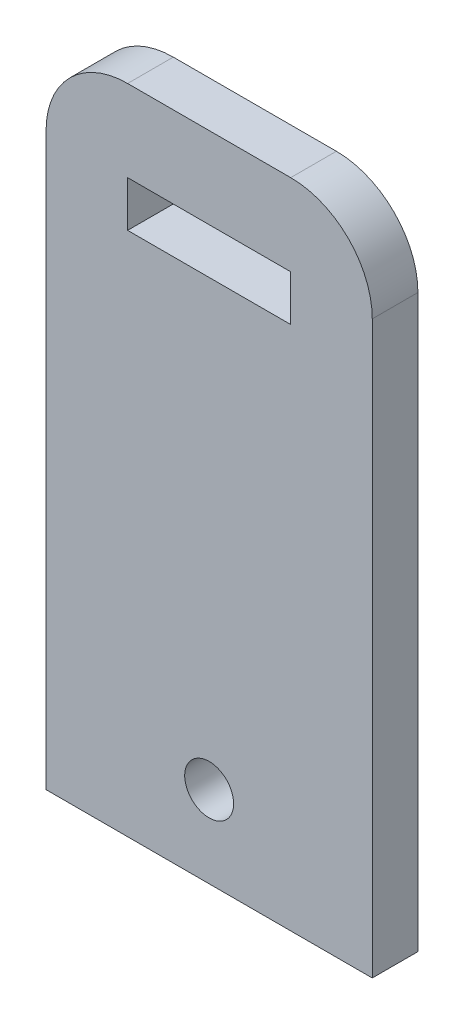
ISO-10303-21;
HEADER;
FILE_DESCRIPTION(('STEP AP214'),'2;1');
FILE_NAME('part.step','',(''),(''),'','','');
FILE_SCHEMA(('AUTOMOTIVE_DESIGN { 1 0 10303 214 1 1 1 1 }'));
ENDSEC;
DATA;
#1=APPLICATION_CONTEXT('core data for automotive mechanical design processes');
#2=APPLICATION_PROTOCOL_DEFINITION('international standard','automotive_design',2000,#1);
#3=PRODUCT_CONTEXT('',#1,'mechanical');
#4=PRODUCT('Part','Part','',(#3));
#5=PRODUCT_RELATED_PRODUCT_CATEGORY('part','',(#4));
#6=PRODUCT_DEFINITION_FORMATION('','',#4);
#7=PRODUCT_DEFINITION_CONTEXT('part definition',#1,'design');
#8=PRODUCT_DEFINITION('design','',#6,#7);
#9=PRODUCT_DEFINITION_SHAPE('','',#8);
#10=(LENGTH_UNIT() NAMED_UNIT(*) SI_UNIT(.MILLI.,.METRE.));
#11=(NAMED_UNIT(*) PLANE_ANGLE_UNIT() SI_UNIT($,.RADIAN.));
#12=(NAMED_UNIT(*) SI_UNIT($,.STERADIAN.) SOLID_ANGLE_UNIT());
#13=UNCERTAINTY_MEASURE_WITH_UNIT(LENGTH_MEASURE(1.E-05),#10,'distance_accuracy_value','');
#14=(GEOMETRIC_REPRESENTATION_CONTEXT(3) GLOBAL_UNCERTAINTY_ASSIGNED_CONTEXT((#13)) GLOBAL_UNIT_ASSIGNED_CONTEXT((#10,
#11,#12)) REPRESENTATION_CONTEXT('',''));
#15=CARTESIAN_POINT('',(0.,0.,0.));
#16=DIRECTION('',(0.,0.,1.));
#17=DIRECTION('',(1.,0.,0.));
#18=AXIS2_PLACEMENT_3D('',#15,#16,#17);
#19=CARTESIAN_POINT('',(219.111848309619,30.8656180362544,2.8));
#20=DIRECTION('',(0.,0.,1.));
#21=DIRECTION('',(1.,0.,0.));
#22=AXIS2_PLACEMENT_3D('',#19,#20,#21);
#23=PLANE('',#22);
#24=DIRECTION('',(1.,0.,0.));
#25=VECTOR('',#24,1.);
#26=CARTESIAN_POINT('',(219.111848309619,28.0656180362544,2.8));
#27=LINE('',#26,#25);
#28=CARTESIAN_POINT('',(219.111848309619,28.0656180362544,2.8));
#29=VERTEX_POINT('',#28);
#30=CARTESIAN_POINT('',(229.111848309619,28.0656180362544,2.8));
#31=VERTEX_POINT('',#30);
#32=EDGE_CURVE('E121',#29,#31,#27,.T.);
#33=ORIENTED_EDGE('',*,*,#32,.F.);
#34=DIRECTION('',(0.,-1.,0.));
#35=VECTOR('',#34,1.);
#36=CARTESIAN_POINT('',(219.111848309619,30.8656180362544,2.8));
#37=LINE('',#36,#35);
#38=CARTESIAN_POINT('',(219.111848309619,30.8656180362544,2.8));
#39=VERTEX_POINT('',#38);
#40=EDGE_CURVE('E113',#39,#29,#37,.T.);
#41=ORIENTED_EDGE('',*,*,#40,.F.);
#42=DIRECTION('',(-1.,0.,0.));
#43=VECTOR('',#42,1.);
#44=CARTESIAN_POINT('',(229.111848309619,30.8656180362544,2.8));
#45=LINE('',#44,#43);
#46=CARTESIAN_POINT('',(229.111848309619,30.8656180362544,2.8));
#47=VERTEX_POINT('',#46);
#48=EDGE_CURVE('E136',#47,#39,#45,.T.);
#49=ORIENTED_EDGE('',*,*,#48,.F.);
#50=DIRECTION('',(0.,1.,0.));
#51=VECTOR('',#50,1.);
#52=CARTESIAN_POINT('',(229.111848309619,28.0656180362544,2.8));
#53=LINE('',#52,#51);
#54=EDGE_CURVE('E134',#31,#47,#53,.T.);
#55=ORIENTED_EDGE('',*,*,#54,.F.);
#56=EDGE_LOOP('',(#33,#41,#49,#55));
#57=FACE_BOUND('',#56,.T.);
#58=CARTESIAN_POINT('',(219.111848309619,30.8656180362544,2.8));
#59=DIRECTION('',(0.,0.,1.));
#60=DIRECTION('',(1.,0.,0.));
#61=AXIS2_PLACEMENT_3D('',#58,#59,#60);
#62=CIRCLE('',#61,4.99999999999999);
#63=CARTESIAN_POINT('',(219.111848309619,35.8656180362543,2.8));
#64=VERTEX_POINT('',#63);
#65=CARTESIAN_POINT('',(214.111848309619,30.8656180362544,2.8));
#66=VERTEX_POINT('',#65);
#67=EDGE_CURVE('E152',#64,#66,#62,.T.);
#68=ORIENTED_EDGE('',*,*,#67,.T.);
#69=DIRECTION('',(0.,-1.,0.));
#70=VECTOR('',#69,1.);
#71=CARTESIAN_POINT('',(214.111848309619,30.8656180362544,2.8));
#72=LINE('',#71,#70);
#73=CARTESIAN_POINT('',(214.111848309619,-4.13438196374565,2.8));
#74=VERTEX_POINT('',#73);
#75=EDGE_CURVE('E155',#66,#74,#72,.T.);
#76=ORIENTED_EDGE('',*,*,#75,.T.);
#77=DIRECTION('',(1.,0.,0.));
#78=VECTOR('',#77,1.);
#79=CARTESIAN_POINT('',(214.111848309619,-4.13438196374565,2.8));
#80=LINE('',#79,#78);
#81=CARTESIAN_POINT('',(234.111848309619,-4.13438196374565,2.8));
#82=VERTEX_POINT('',#81);
#83=EDGE_CURVE('E158',#74,#82,#80,.T.);
#84=ORIENTED_EDGE('',*,*,#83,.T.);
#85=DIRECTION('',(0.,1.,0.));
#86=VECTOR('',#85,1.);
#87=CARTESIAN_POINT('',(234.111848309619,-4.13438196374565,2.8));
#88=LINE('',#87,#86);
#89=CARTESIAN_POINT('',(234.111848309619,30.8656180362544,2.8));
#90=VERTEX_POINT('',#89);
#91=EDGE_CURVE('E160',#82,#90,#88,.T.);
#92=ORIENTED_EDGE('',*,*,#91,.T.);
#93=CARTESIAN_POINT('',(229.111848309619,30.8656180362544,2.8));
#94=DIRECTION('',(0.,0.,1.));
#95=DIRECTION('',(1.,0.,0.));
#96=AXIS2_PLACEMENT_3D('',#93,#94,#95);
#97=CIRCLE('',#96,4.99999999999999);
#98=CARTESIAN_POINT('',(229.111848309619,35.8656180362543,2.8));
#99=VERTEX_POINT('',#98);
#100=EDGE_CURVE('E162',#90,#99,#97,.T.);
#101=ORIENTED_EDGE('',*,*,#100,.T.);
#102=DIRECTION('',(-1.,0.,0.));
#103=VECTOR('',#102,1.);
#104=CARTESIAN_POINT('',(229.111848309619,35.8656180362543,2.8));
#105=LINE('',#104,#103);
#106=EDGE_CURVE('E164',#99,#64,#105,.T.);
#107=ORIENTED_EDGE('',*,*,#106,.T.);
#108=EDGE_LOOP('',(#68,#76,#84,#92,#101,#107));
#109=FACE_BOUND('',#108,.T.);
#110=CARTESIAN_POINT('',(224.111848309619,0.865618036254359,2.8));
#111=DIRECTION('',(0.,0.,1.));
#112=DIRECTION('',(1.,0.,0.));
#113=AXIS2_PLACEMENT_3D('',#110,#111,#112);
#114=CIRCLE('',#113,1.5);
#115=CARTESIAN_POINT('',(225.611848309619,0.865618036254359,2.8));
#116=VERTEX_POINT('',#115);
#117=EDGE_CURVE('E142',#116,#116,#114,.T.);
#118=ORIENTED_EDGE('',*,*,#117,.F.);
#119=EDGE_LOOP('',(#118));
#120=FACE_BOUND('',#119,.T.);
#121=ADVANCED_FACE('F36',(#57,#109,#120),#23,.T.);
#122=CARTESIAN_POINT('',(219.111848309619,30.8656180362544,0.));
#123=DIRECTION('',(0.,0.,1.));
#124=DIRECTION('',(1.,0.,0.));
#125=AXIS2_PLACEMENT_3D('',#122,#123,#124);
#126=PLANE('',#125);
#127=CARTESIAN_POINT('',(219.111848309619,30.8656180362544,0.));
#128=DIRECTION('',(0.,0.,1.));
#129=DIRECTION('',(1.,0.,0.));
#130=AXIS2_PLACEMENT_3D('',#127,#128,#129);
#131=CIRCLE('',#130,4.99999999999999);
#132=CARTESIAN_POINT('',(219.111848309619,35.8656180362543,0.));
#133=VERTEX_POINT('',#132);
#134=CARTESIAN_POINT('',(214.111848309619,30.8656180362544,0.));
#135=VERTEX_POINT('',#134);
#136=EDGE_CURVE('E129',#133,#135,#131,.T.);
#137=ORIENTED_EDGE('',*,*,#136,.F.);
#138=DIRECTION('',(-1.,0.,0.));
#139=VECTOR('',#138,1.);
#140=CARTESIAN_POINT('',(229.111848309619,35.8656180362543,0.));
#141=LINE('',#140,#139);
#142=CARTESIAN_POINT('',(229.111848309619,35.8656180362543,0.));
#143=VERTEX_POINT('',#142);
#144=EDGE_CURVE('E156',#143,#133,#141,.T.);
#145=ORIENTED_EDGE('',*,*,#144,.F.);
#146=CARTESIAN_POINT('',(229.111848309619,30.8656180362544,0.));
#147=DIRECTION('',(0.,0.,1.));
#148=DIRECTION('',(1.,0.,0.));
#149=AXIS2_PLACEMENT_3D('',#146,#147,#148);
#150=CIRCLE('',#149,4.99999999999999);
#151=CARTESIAN_POINT('',(234.111848309619,30.8656180362544,0.));
#152=VERTEX_POINT('',#151);
#153=EDGE_CURVE('E175',#152,#143,#150,.T.);
#154=ORIENTED_EDGE('',*,*,#153,.F.);
#155=DIRECTION('',(0.,1.,0.));
#156=VECTOR('',#155,1.);
#157=CARTESIAN_POINT('',(234.111848309619,-4.13438196374565,0.));
#158=LINE('',#157,#156);
#159=CARTESIAN_POINT('',(234.111848309619,-4.13438196374565,0.));
#160=VERTEX_POINT('',#159);
#161=EDGE_CURVE('E173',#160,#152,#158,.T.);
#162=ORIENTED_EDGE('',*,*,#161,.F.);
#163=DIRECTION('',(1.,0.,0.));
#164=VECTOR('',#163,1.);
#165=CARTESIAN_POINT('',(214.111848309619,-4.13438196374565,0.));
#166=LINE('',#165,#164);
#167=CARTESIAN_POINT('',(214.111848309619,-4.13438196374565,0.));
#168=VERTEX_POINT('',#167);
#169=EDGE_CURVE('E171',#168,#160,#166,.T.);
#170=ORIENTED_EDGE('',*,*,#169,.F.);
#171=DIRECTION('',(0.,-1.,0.));
#172=VECTOR('',#171,1.);
#173=CARTESIAN_POINT('',(214.111848309619,30.8656180362544,0.));
#174=LINE('',#173,#172);
#175=EDGE_CURVE('E169',#135,#168,#174,.T.);
#176=ORIENTED_EDGE('',*,*,#175,.F.);
#177=EDGE_LOOP('',(#137,#145,#154,#162,#170,#176));
#178=FACE_BOUND('',#177,.T.);
#179=DIRECTION('',(0.,-1.,0.));
#180=VECTOR('',#179,1.);
#181=CARTESIAN_POINT('',(219.111848309619,30.8656180362544,0.));
#182=LINE('',#181,#180);
#183=CARTESIAN_POINT('',(219.111848309619,30.8656180362544,0.));
#184=VERTEX_POINT('',#183);
#185=CARTESIAN_POINT('',(219.111848309619,28.0656180362544,0.));
#186=VERTEX_POINT('',#185);
#187=EDGE_CURVE('E59',#184,#186,#182,.T.);
#188=ORIENTED_EDGE('',*,*,#187,.T.);
#189=DIRECTION('',(1.,0.,0.));
#190=VECTOR('',#189,1.);
#191=CARTESIAN_POINT('',(219.111848309619,28.0656180362544,0.));
#192=LINE('',#191,#190);
#193=CARTESIAN_POINT('',(229.111848309619,28.0656180362544,0.));
#194=VERTEX_POINT('',#193);
#195=EDGE_CURVE('E128',#186,#194,#192,.T.);
#196=ORIENTED_EDGE('',*,*,#195,.T.);
#197=DIRECTION('',(0.,1.,0.));
#198=VECTOR('',#197,1.);
#199=CARTESIAN_POINT('',(229.111848309619,28.0656180362544,0.));
#200=LINE('',#199,#198);
#201=CARTESIAN_POINT('',(229.111848309619,30.8656180362544,0.));
#202=VERTEX_POINT('',#201);
#203=EDGE_CURVE('E144',#194,#202,#200,.T.);
#204=ORIENTED_EDGE('',*,*,#203,.T.);
#205=DIRECTION('',(-1.,0.,0.));
#206=VECTOR('',#205,1.);
#207=CARTESIAN_POINT('',(224.111848309619,30.8656180362544,0.));
#208=LINE('',#207,#206);
#209=EDGE_CURVE('E122',#202,#184,#208,.T.);
#210=ORIENTED_EDGE('',*,*,#209,.T.);
#211=EDGE_LOOP('',(#188,#196,#204,#210));
#212=FACE_BOUND('',#211,.T.);
#213=CARTESIAN_POINT('',(224.111848309619,0.865618036254359,0.));
#214=DIRECTION('',(0.,0.,1.));
#215=DIRECTION('',(1.,0.,0.));
#216=AXIS2_PLACEMENT_3D('',#213,#214,#215);
#217=CIRCLE('',#216,1.5);
#218=CARTESIAN_POINT('',(225.611848309619,0.865618036254359,0.));
#219=VERTEX_POINT('',#218);
#220=EDGE_CURVE('E254',#219,#219,#217,.T.);
#221=ORIENTED_EDGE('',*,*,#220,.T.);
#222=EDGE_LOOP('',(#221));
#223=FACE_BOUND('',#222,.T.);
#224=ADVANCED_FACE('F199',(#178,#212,#223),#126,.F.);
#225=CARTESIAN_POINT('',(219.111848309619,30.8656180362544,2.8));
#226=DIRECTION('',(0.,0.,-1.));
#227=DIRECTION('',(-1.,0.,0.));
#228=AXIS2_PLACEMENT_3D('',#225,#226,#227);
#229=CYLINDRICAL_SURFACE('',#228,4.99999999999999);
#230=ORIENTED_EDGE('',*,*,#136,.T.);
#231=DIRECTION('',(0.,0.,-1.));
#232=VECTOR('',#231,1.);
#233=CARTESIAN_POINT('',(214.111848309619,30.8656180362544,2.8));
#234=LINE('',#233,#232);
#235=EDGE_CURVE('E11',#66,#135,#234,.T.);
#236=ORIENTED_EDGE('',*,*,#235,.F.);
#237=ORIENTED_EDGE('',*,*,#67,.F.);
#238=DIRECTION('',(0.,0.,-1.));
#239=VECTOR('',#238,1.);
#240=CARTESIAN_POINT('',(219.111848309619,35.8656180362543,2.8));
#241=LINE('',#240,#239);
#242=EDGE_CURVE('E166',#64,#133,#241,.T.);
#243=ORIENTED_EDGE('',*,*,#242,.T.);
#244=EDGE_LOOP('',(#230,#236,#237,#243));
#245=FACE_BOUND('',#244,.T.);
#246=ADVANCED_FACE('F38',(#245),#229,.T.);
#247=CARTESIAN_POINT('',(214.111848309619,30.8656180362544,2.8));
#248=DIRECTION('',(1.,0.,0.));
#249=DIRECTION('',(0.,0.,-1.));
#250=AXIS2_PLACEMENT_3D('',#247,#248,#249);
#251=PLANE('',#250);
#252=ORIENTED_EDGE('',*,*,#175,.T.);
#253=DIRECTION('',(0.,0.,-1.));
#254=VECTOR('',#253,1.);
#255=CARTESIAN_POINT('',(214.111848309619,-4.13438196374565,2.8));
#256=LINE('',#255,#254);
#257=EDGE_CURVE('E44',#74,#168,#256,.T.);
#258=ORIENTED_EDGE('',*,*,#257,.F.);
#259=ORIENTED_EDGE('',*,*,#75,.F.);
#260=ORIENTED_EDGE('',*,*,#235,.T.);
#261=EDGE_LOOP('',(#252,#258,#259,#260));
#262=FACE_BOUND('',#261,.T.);
#263=ADVANCED_FACE('F216',(#262),#251,.F.);
#264=CARTESIAN_POINT('',(214.111848309619,-4.13438196374565,2.8));
#265=DIRECTION('',(0.,1.,0.));
#266=DIRECTION('',(0.,0.,1.));
#267=AXIS2_PLACEMENT_3D('',#264,#265,#266);
#268=PLANE('',#267);
#269=ORIENTED_EDGE('',*,*,#169,.T.);
#270=DIRECTION('',(0.,0.,-1.));
#271=VECTOR('',#270,1.);
#272=CARTESIAN_POINT('',(234.111848309619,-4.13438196374565,2.8));
#273=LINE('',#272,#271);
#274=EDGE_CURVE('E186',#82,#160,#273,.T.);
#275=ORIENTED_EDGE('',*,*,#274,.F.);
#276=ORIENTED_EDGE('',*,*,#83,.F.);
#277=ORIENTED_EDGE('',*,*,#257,.T.);
#278=EDGE_LOOP('',(#269,#275,#276,#277));
#279=FACE_BOUND('',#278,.T.);
#280=ADVANCED_FACE('F193',(#279),#268,.F.);
#281=CARTESIAN_POINT('',(234.111848309619,-4.13438196374565,2.8));
#282=DIRECTION('',(-1.,0.,0.));
#283=DIRECTION('',(0.,0.,1.));
#284=AXIS2_PLACEMENT_3D('',#281,#282,#283);
#285=PLANE('',#284);
#286=ORIENTED_EDGE('',*,*,#161,.T.);
#287=DIRECTION('',(0.,0.,-1.));
#288=VECTOR('',#287,1.);
#289=CARTESIAN_POINT('',(234.111848309619,30.8656180362544,2.8));
#290=LINE('',#289,#288);
#291=EDGE_CURVE('E183',#90,#152,#290,.T.);
#292=ORIENTED_EDGE('',*,*,#291,.F.);
#293=ORIENTED_EDGE('',*,*,#91,.F.);
#294=ORIENTED_EDGE('',*,*,#274,.T.);
#295=EDGE_LOOP('',(#286,#292,#293,#294));
#296=FACE_BOUND('',#295,.T.);
#297=ADVANCED_FACE('F205',(#296),#285,.F.);
#298=CARTESIAN_POINT('',(229.111848309619,30.8656180362544,2.8));
#299=DIRECTION('',(0.,0.,-1.));
#300=DIRECTION('',(-1.,0.,0.));
#301=AXIS2_PLACEMENT_3D('',#298,#299,#300);
#302=CYLINDRICAL_SURFACE('',#301,4.99999999999999);
#303=ORIENTED_EDGE('',*,*,#153,.T.);
#304=DIRECTION('',(0.,0.,-1.));
#305=VECTOR('',#304,1.);
#306=CARTESIAN_POINT('',(229.111848309619,35.8656180362543,2.8));
#307=LINE('',#306,#305);
#308=EDGE_CURVE('E180',#99,#143,#307,.T.);
#309=ORIENTED_EDGE('',*,*,#308,.F.);
#310=ORIENTED_EDGE('',*,*,#100,.F.);
#311=ORIENTED_EDGE('',*,*,#291,.T.);
#312=EDGE_LOOP('',(#303,#309,#310,#311));
#313=FACE_BOUND('',#312,.T.);
#314=ADVANCED_FACE('F209',(#313),#302,.T.);
#315=CARTESIAN_POINT('',(229.111848309619,35.8656180362543,2.8));
#316=DIRECTION('',(0.,-1.,0.));
#317=DIRECTION('',(0.,0.,-1.));
#318=AXIS2_PLACEMENT_3D('',#315,#316,#317);
#319=PLANE('',#318);
#320=ORIENTED_EDGE('',*,*,#144,.T.);
#321=ORIENTED_EDGE('',*,*,#242,.F.);
#322=ORIENTED_EDGE('',*,*,#106,.F.);
#323=ORIENTED_EDGE('',*,*,#308,.T.);
#324=EDGE_LOOP('',(#320,#321,#322,#323));
#325=FACE_BOUND('',#324,.T.);
#326=ADVANCED_FACE('F219',(#325),#319,.F.);
#327=CARTESIAN_POINT('',(219.111848309619,30.8656180362544,2.8));
#328=DIRECTION('',(1.,0.,0.));
#329=DIRECTION('',(0.,0.,-1.));
#330=AXIS2_PLACEMENT_3D('',#327,#328,#329);
#331=PLANE('',#330);
#332=ORIENTED_EDGE('',*,*,#187,.F.);
#333=DIRECTION('',(0.,0.,-1.));
#334=VECTOR('',#333,1.);
#335=CARTESIAN_POINT('',(219.111848309619,30.8656180362544,2.8));
#336=LINE('',#335,#334);
#337=EDGE_CURVE('E117',#39,#184,#336,.T.);
#338=ORIENTED_EDGE('',*,*,#337,.F.);
#339=ORIENTED_EDGE('',*,*,#40,.T.);
#340=DIRECTION('',(0.,0.,-1.));
#341=VECTOR('',#340,1.);
#342=CARTESIAN_POINT('',(219.111848309619,28.0656180362544,2.8));
#343=LINE('',#342,#341);
#344=EDGE_CURVE('E116',#29,#186,#343,.T.);
#345=ORIENTED_EDGE('',*,*,#344,.T.);
#346=EDGE_LOOP('',(#332,#338,#339,#345));
#347=FACE_BOUND('',#346,.T.);
#348=ADVANCED_FACE('F115',(#347),#331,.T.);
#349=CARTESIAN_POINT('',(219.111848309619,28.0656180362544,2.8));
#350=DIRECTION('',(0.,1.,0.));
#351=DIRECTION('',(0.,0.,1.));
#352=AXIS2_PLACEMENT_3D('',#349,#350,#351);
#353=PLANE('',#352);
#354=ORIENTED_EDGE('',*,*,#195,.F.);
#355=ORIENTED_EDGE('',*,*,#344,.F.);
#356=ORIENTED_EDGE('',*,*,#32,.T.);
#357=DIRECTION('',(0.,0.,-1.));
#358=VECTOR('',#357,1.);
#359=CARTESIAN_POINT('',(229.111848309619,28.0656180362544,2.8));
#360=LINE('',#359,#358);
#361=EDGE_CURVE('E130',#31,#194,#360,.T.);
#362=ORIENTED_EDGE('',*,*,#361,.T.);
#363=EDGE_LOOP('',(#354,#355,#356,#362));
#364=FACE_BOUND('',#363,.T.);
#365=ADVANCED_FACE('F125',(#364),#353,.T.);
#366=CARTESIAN_POINT('',(229.111848309619,28.0656180362544,2.8));
#367=DIRECTION('',(-1.,0.,0.));
#368=DIRECTION('',(0.,0.,1.));
#369=AXIS2_PLACEMENT_3D('',#366,#367,#368);
#370=PLANE('',#369);
#371=ORIENTED_EDGE('',*,*,#203,.F.);
#372=ORIENTED_EDGE('',*,*,#361,.F.);
#373=ORIENTED_EDGE('',*,*,#54,.T.);
#374=DIRECTION('',(0.,0.,-1.));
#375=VECTOR('',#374,1.);
#376=CARTESIAN_POINT('',(229.111848309619,30.8656180362544,2.8));
#377=LINE('',#376,#375);
#378=EDGE_CURVE('E51',#47,#202,#377,.T.);
#379=ORIENTED_EDGE('',*,*,#378,.T.);
#380=EDGE_LOOP('',(#371,#372,#373,#379));
#381=FACE_BOUND('',#380,.T.);
#382=ADVANCED_FACE('F237',(#381),#370,.T.);
#383=CARTESIAN_POINT('',(224.111848309619,30.8656180362544,2.8));
#384=DIRECTION('',(0.,-1.,0.));
#385=DIRECTION('',(0.,0.,-1.));
#386=AXIS2_PLACEMENT_3D('',#383,#384,#385);
#387=PLANE('',#386);
#388=ORIENTED_EDGE('',*,*,#209,.F.);
#389=ORIENTED_EDGE('',*,*,#378,.F.);
#390=ORIENTED_EDGE('',*,*,#48,.T.);
#391=ORIENTED_EDGE('',*,*,#337,.T.);
#392=EDGE_LOOP('',(#388,#389,#390,#391));
#393=FACE_BOUND('',#392,.T.);
#394=ADVANCED_FACE('F240',(#393),#387,.T.);
#395=CARTESIAN_POINT('',(224.111848309619,0.865618036254359,2.8));
#396=DIRECTION('',(0.,0.,-1.));
#397=DIRECTION('',(-1.,0.,0.));
#398=AXIS2_PLACEMENT_3D('',#395,#396,#397);
#399=CYLINDRICAL_SURFACE('',#398,1.5);
#400=ORIENTED_EDGE('',*,*,#117,.T.);
#401=EDGE_LOOP('',(#400));
#402=FACE_BOUND('',#401,.T.);
#403=ORIENTED_EDGE('',*,*,#220,.F.);
#404=EDGE_LOOP('',(#403));
#405=FACE_BOUND('',#404,.T.);
#406=ADVANCED_FACE('F244',(#402,#405),#399,.F.);
#407=CLOSED_SHELL('',(#121,#224,#246,#263,#280,#297,#314,#326,#348,#365,#382,#394,#406));
#408=MANIFOLD_SOLID_BREP('B2',#407);
#409=ADVANCED_BREP_SHAPE_REPRESENTATION('',(#18,#408),#14);
#410=SHAPE_DEFINITION_REPRESENTATION(#9,#409);
ENDSEC;
END-ISO-10303-21;
